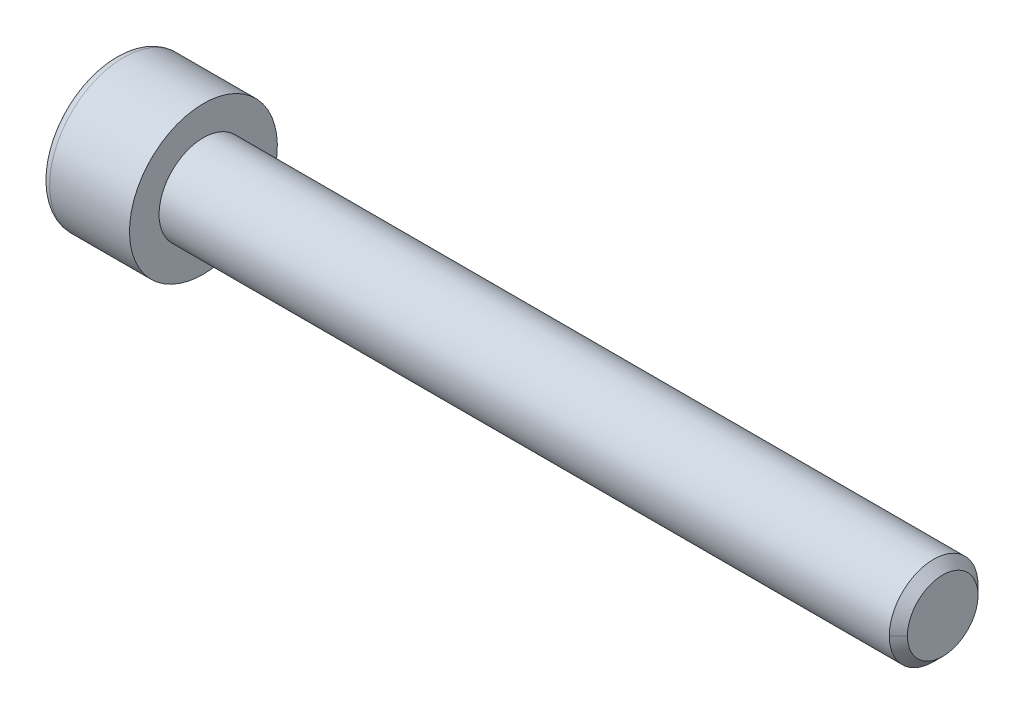
ISO-10303-21;
HEADER;
FILE_DESCRIPTION(('STEP AP214'),'2;1');
FILE_NAME('part.step','',(''),(''),'','','');
FILE_SCHEMA(('AUTOMOTIVE_DESIGN { 1 0 10303 214 1 1 1 1 }'));
ENDSEC;
DATA;
#1=APPLICATION_CONTEXT('core data for automotive mechanical design processes');
#2=APPLICATION_PROTOCOL_DEFINITION('international standard','automotive_design',2000,#1);
#3=PRODUCT_CONTEXT('',#1,'mechanical');
#4=PRODUCT('Part','Part','',(#3));
#5=PRODUCT_RELATED_PRODUCT_CATEGORY('part','',(#4));
#6=PRODUCT_DEFINITION_FORMATION('','',#4);
#7=PRODUCT_DEFINITION_CONTEXT('part definition',#1,'design');
#8=PRODUCT_DEFINITION('design','',#6,#7);
#9=PRODUCT_DEFINITION_SHAPE('','',#8);
#10=(LENGTH_UNIT() NAMED_UNIT(*) SI_UNIT(.MILLI.,.METRE.));
#11=(NAMED_UNIT(*) PLANE_ANGLE_UNIT() SI_UNIT($,.RADIAN.));
#12=(NAMED_UNIT(*) SI_UNIT($,.STERADIAN.) SOLID_ANGLE_UNIT());
#13=UNCERTAINTY_MEASURE_WITH_UNIT(LENGTH_MEASURE(1.E-05),#10,'distance_accuracy_value','');
#14=(GEOMETRIC_REPRESENTATION_CONTEXT(3) GLOBAL_UNCERTAINTY_ASSIGNED_CONTEXT((#13)) GLOBAL_UNIT_ASSIGNED_CONTEXT((#10,
#11,#12)) REPRESENTATION_CONTEXT('',''));
#15=CARTESIAN_POINT('',(0.,0.,0.));
#16=DIRECTION('',(0.,0.,1.));
#17=DIRECTION('',(1.,0.,0.));
#18=AXIS2_PLACEMENT_3D('',#15,#16,#17);
#19=CARTESIAN_POINT('',(50.,-2.4151886,-2.4151886));
#20=DIRECTION('',(1.,0.,0.));
#21=DIRECTION('',(0.,1.,0.));
#22=AXIS2_PLACEMENT_3D('',#19,#20,#21);
#23=PLANE('',#22);
#24=CARTESIAN_POINT('',(50.,0.,0.));
#25=DIRECTION('',(-1.,0.,0.));
#26=DIRECTION('',(0.,0.,1.));
#27=AXIS2_PLACEMENT_3D('',#24,#25,#26);
#28=CIRCLE('',#27,2.38655);
#29=CARTESIAN_POINT('',(50.,-8.1581597892579E-10,-2.38654999999998));
#30=VERTEX_POINT('',#29);
#31=CARTESIAN_POINT('',(50.,-2.85727898792572E-10,2.38654999999998));
#32=VERTEX_POINT('',#31);
#33=EDGE_CURVE('E88',#30,#32,#28,.F.);
#34=ORIENTED_EDGE('',*,*,#33,.T.);
#35=CARTESIAN_POINT('',(50.,0.,0.));
#36=DIRECTION('',(-1.,0.,0.));
#37=DIRECTION('',(0.,0.,1.));
#38=AXIS2_PLACEMENT_3D('',#35,#36,#37);
#39=CIRCLE('',#38,2.38655);
#40=EDGE_CURVE('E21',#32,#30,#39,.F.);
#41=ORIENTED_EDGE('',*,*,#40,.T.);
#42=EDGE_LOOP('',(#34,#41));
#43=FACE_BOUND('',#42,.T.);
#44=ADVANCED_FACE('F17',(#43),#23,.T.);
#45=CARTESIAN_POINT('',(50.,0.,2.38655));
#46=CARTESIAN_POINT('',(49.38655,0.,3.));
#47=(BOUNDED_CURVE() B_SPLINE_CURVE(1,(#45,#46),.UNSPECIFIED.,.F.,
.F.) B_SPLINE_CURVE_WITH_KNOTS((2,2),(0.,1.00000000000009),
.UNSPECIFIED.) CURVE() GEOMETRIC_REPRESENTATION_ITEM() RATIONAL_B_SPLINE_CURVE((1.,1.)) REPRESENTATION_ITEM(''));
#48=CARTESIAN_POINT('',(1049.38655,0.,0.));
#49=DIRECTION('',(-1.,0.,0.));
#50=AXIS1_PLACEMENT('',#48,#49);
#51=SURFACE_OF_REVOLUTION('',#47,#50);
#52=ORIENTED_EDGE('',*,*,#40,.F.);
#53=DIRECTION('',(-0.707106781186548,-1.26986739101621E-10,0.707106781186547));
#54=VECTOR('',#53,1.);
#55=CARTESIAN_POINT('',(49.693275,-4.83675477104059E-10,2.693275));
#56=LINE('',#55,#54);
#57=CARTESIAN_POINT('',(49.38655,-2.69379553018567E-10,2.99999999999999));
#58=VERTEX_POINT('',#57);
#59=EDGE_CURVE('E91',#32,#58,#56,.T.);
#60=ORIENTED_EDGE('',*,*,#59,.T.);
#61=CARTESIAN_POINT('',(49.38655,0.,0.));
#62=DIRECTION('',(-1.,0.,0.));
#63=DIRECTION('',(0.,0.,1.));
#64=AXIS2_PLACEMENT_3D('',#61,#62,#63);
#65=CIRCLE('',#64,3.);
#66=CARTESIAN_POINT('',(49.38655,-1.23062057109198E-09,-2.99999999999999));
#67=VERTEX_POINT('',#66);
#68=EDGE_CURVE('E95',#58,#67,#65,.F.);
#69=ORIENTED_EDGE('',*,*,#68,.T.);
#70=DIRECTION('',(0.707106781186548,2.90060050295602E-10,0.707106781186547));
#71=VECTOR('',#70,1.);
#72=CARTESIAN_POINT('',(49.693275,-1.10479987286926E-09,-2.693275));
#73=LINE('',#72,#71);
#74=EDGE_CURVE('E93',#67,#30,#73,.T.);
#75=ORIENTED_EDGE('',*,*,#74,.T.);
#76=EDGE_LOOP('',(#52,#60,#69,#75));
#77=FACE_BOUND('',#76,.T.);
#78=ADVANCED_FACE('F94',(#77),#51,.T.);
#79=CARTESIAN_POINT('',(50.0001414213562,0.,2.38640857864376));
#80=CARTESIAN_POINT('',(50.,0.,2.38655));
#81=CARTESIAN_POINT('',(49.38655,0.,3.));
#82=(BOUNDED_CURVE() B_SPLINE_CURVE(1,(#79,#80,#81),.UNSPECIFIED.,.F.,
.F.) B_SPLINE_CURVE_WITH_KNOTS((2,1,2),(-0.000230534427968627,1.85790651661862E-11,1.),
.UNSPECIFIED.) CURVE() GEOMETRIC_REPRESENTATION_ITEM() RATIONAL_B_SPLINE_CURVE((1.,1.,1.)) REPRESENTATION_ITEM(''));
#83=CARTESIAN_POINT('',(1049.38655,0.,0.));
#84=DIRECTION('',(-1.,0.,0.));
#85=AXIS1_PLACEMENT('',#83,#84);
#86=SURFACE_OF_REVOLUTION('',#82,#85);
#87=ORIENTED_EDGE('',*,*,#74,.F.);
#88=CARTESIAN_POINT('',(49.38655,0.,0.));
#89=DIRECTION('',(-1.,0.,0.));
#90=DIRECTION('',(0.,0.,1.));
#91=AXIS2_PLACEMENT_3D('',#88,#89,#90);
#92=CIRCLE('',#91,3.);
#93=EDGE_CURVE('E108',#67,#58,#92,.F.);
#94=ORIENTED_EDGE('',*,*,#93,.T.);
#95=ORIENTED_EDGE('',*,*,#59,.F.);
#96=ORIENTED_EDGE('',*,*,#33,.F.);
#97=EDGE_LOOP('',(#87,#94,#95,#96));
#98=FACE_BOUND('',#97,.T.);
#99=ADVANCED_FACE('F101',(#98),#86,.T.);
#100=CARTESIAN_POINT('',(-1.333333333,0.,0.));
#101=CARTESIAN_POINT('',(-3.01,0.,2.904071854));
#102=(BOUNDED_CURVE() B_SPLINE_CURVE(1,(#100,#101),.UNSPECIFIED.,.F.,
.F.) B_SPLINE_CURVE_WITH_KNOTS((2,2),(0.,1.),
.UNSPECIFIED.) CURVE() GEOMETRIC_REPRESENTATION_ITEM() RATIONAL_B_SPLINE_CURVE((1.,1.)) REPRESENTATION_ITEM(''));
#103=CARTESIAN_POINT('',(996.99,0.,0.));
#104=DIRECTION('',(-1.,0.,0.));
#105=AXIS1_PLACEMENT('',#103,#104);
#106=SURFACE_OF_REVOLUTION('',#102,#105);
#107=CARTESIAN_POINT('',(-1.333333333,0.,0.));
#108=VERTEX_POINT('',#107);
#109=VERTEX_LOOP('',#108);
#110=FACE_BOUND('',#109,.T.);
#111=CARTESIAN_POINT('',(-2.99999999990194,-2.5,-1.44337567259391));
#112=CARTESIAN_POINT('',(-2.98209574263693,-2.5,-1.38134905294953));
#113=CARTESIAN_POINT('',(-2.96498591501795,-2.5,-1.31908524854831));
#114=CARTESIAN_POINT('',(-2.9325586063815,-2.5,-1.19402341340579));
#115=CARTESIAN_POINT('',(-2.91724304001177,-2.5,-1.13122488732653));
#116=CARTESIAN_POINT('',(-2.88864230481174,-2.5,-1.00514627159482));
#117=CARTESIAN_POINT('',(-2.87535773971234,-2.5,-0.941866044598566));
#118=CARTESIAN_POINT('',(-2.84501155623976,-2.5,-0.783295355537952));
#119=CARTESIAN_POINT('',(-2.82935510407788,-2.5,-0.687729720023883));
#120=CARTESIAN_POINT('',(-2.8038363929103,-2.5,-0.49582792968208));
#121=CARTESIAN_POINT('',(-2.79397345365601,-2.5,-0.399491866661438));
#122=CARTESIAN_POINT('',(-2.78132126682311,-2.5,-0.217329774455165));
#123=CARTESIAN_POINT('',(-2.77785668029329,-2.5,-0.13155078285884));
#124=CARTESIAN_POINT('',(-2.77604418751081,-2.5,0.0400958904405022));
#125=CARTESIAN_POINT('',(-2.77769824160356,-2.5,0.125963593529663));
#126=CARTESIAN_POINT('',(-2.78605196619317,-2.5,0.297450074329791));
#127=CARTESIAN_POINT('',(-2.79275167480722,-2.5,0.383068850155342));
#128=CARTESIAN_POINT('',(-2.8108998117244,-2.5,0.553755303851712));
#129=CARTESIAN_POINT('',(-2.82234605098717,-2.5,0.638823217429646));
#130=CARTESIAN_POINT('',(-2.84954081955049,-2.5,0.808258474159647));
#131=CARTESIAN_POINT('',(-2.86528928104194,-2.5,0.892625828331925));
#132=CARTESIAN_POINT('',(-2.90056247218591,-2.5,1.06053688925276));
#133=CARTESIAN_POINT('',(-2.92008612509887,-2.5,1.14408082372909));
#134=CARTESIAN_POINT('',(-2.95044571186063,-2.5,1.26341360873709));
#135=CARTESIAN_POINT('',(-2.95996603514937,-2.5,1.29954359668296));
#136=CARTESIAN_POINT('',(-2.9795691964924,-2.5,1.37159959189587));
#137=CARTESIAN_POINT('',(-2.98965127625646,-2.5,1.40752580531338));
#138=CARTESIAN_POINT('',(-2.99999999995315,-2.5,1.44337567277131));
#139=B_SPLINE_CURVE_WITH_KNOTS('',3,(#111,#112,#113,#114,#115,#116,#117,#118,#119,#120,#121,
#122,#123,#124,#125,#126,#127,#128,#129,#130,#131,#132,#133,#134,#135,#136,#137,#138),
.UNSPECIFIED.,.F.,.F.,(4,2,2,2,2,2,2,2,2,2,2,2,2,4),(0.,0.193683427773067,0.38757168712609,
0.581517469676064,0.871873940003063,1.16219631114209,1.41959520256128,1.67709268522974,
1.93459211317248,2.1919729174537,2.44934966528471,2.70665311350898,2.81873929256059,
2.93067767377976),.UNSPECIFIED.);
#140=CARTESIAN_POINT('',(-2.99999999985056,-2.49999999997164,-1.44337567301637));
#141=VERTEX_POINT('',#140);
#142=CARTESIAN_POINT('',(-2.9999999999511,-2.49999999989483,1.44337567294638));
#143=VERTEX_POINT('',#142);
#144=EDGE_CURVE('E400',#141,#143,#139,.T.);
#145=ORIENTED_EDGE('',*,*,#144,.T.);
#146=CARTESIAN_POINT('',(-2.99999999994905,-2.49999999978965,1.44337567312145));
#147=CARTESIAN_POINT('',(-2.98209574268285,-2.44628337146572,1.47438898294478));
#148=CARTESIAN_POINT('',(-2.96498591506263,-2.39236133511698,1.50552088514654));
#149=CARTESIAN_POINT('',(-2.93255860642365,-2.2840546088376,1.56805180272011));
#150=CARTESIAN_POINT('',(-2.91724304005265,-2.22966948993171,1.5994510657609));
#151=CARTESIAN_POINT('',(-2.88864230485011,-2.12048220583196,1.66249037362911));
#152=CARTESIAN_POINT('',(-2.87535773974946,-2.06567992169489,1.69413048712842));
#153=CARTESIAN_POINT('',(-2.84501155627371,-1.92835367666992,1.77341583166181));
#154=CARTESIAN_POINT('',(-2.82935510410985,-1.84559140858412,1.82119864942075));
#155=CARTESIAN_POINT('',(-2.80383639293848,-1.67939958311269,1.91714954459552));
#156=CARTESIAN_POINT('',(-2.79397345368236,-1.59597010523433,1.96531757610781));
#157=CARTESIAN_POINT('',(-2.78132126684628,-1.43821310577522,2.05639862221371));
#158=CARTESIAN_POINT('',(-2.77785668031497,-1.36392631994176,2.09928811801266));
#159=CARTESIAN_POINT('',(-2.77604418752952,-1.2152759403893,2.18511145466395));
#160=CARTESIAN_POINT('',(-2.77769824162078,-1.14091232814936,2.22804530620937));
#161=CARTESIAN_POINT('',(-2.78605196620749,-0.992400679370574,2.31378854661114));
#162=CARTESIAN_POINT('',(-2.79275167482015,-0.918252644464542,2.35659793452478));
#163=CARTESIAN_POINT('',(-2.81089981173457,-0.770433839481277,2.44194116137469));
#164=CARTESIAN_POINT('',(-2.82234605099598,-0.696762865275693,2.48447511816451));
#165=CARTESIAN_POINT('',(-2.8495408195567,-0.550027628650418,2.56919274653124));
#166=CARTESIAN_POINT('',(-2.86528928104691,-0.476963356686943,2.61137642361826));
#167=CARTESIAN_POINT('',(-2.90056247218859,-0.331548112352686,2.69533195408042));
#168=CARTESIAN_POINT('',(-2.9200861251005,-0.259196942763867,2.73710392131946));
#169=CARTESIAN_POINT('',(-2.95044571185584,-0.155851719459382,2.79677031381484));
#170=CARTESIAN_POINT('',(-2.95996603513881,-0.124562232076772,2.81483530777832));
#171=CARTESIAN_POINT('',(-2.97956919646974,-0.0621599097610845,2.85086330536599));
#172=CARTESIAN_POINT('',(-2.98965127622746,-0.0310468962964689,2.86882641206541));
#173=CARTESIAN_POINT('',(-2.99999999991754,-3.72252951759761E-10,2.88675134578508));
#174=B_SPLINE_CURVE_WITH_KNOTS('',3,(#146,#147,#148,#149,#150,#151,#152,#153,#154,#155,#156,
#157,#158,#159,#160,#161,#162,#163,#164,#165,#166,#167,#168,#169,#170,#171,#172,#173),
.UNSPECIFIED.,.F.,.F.,(4,2,2,2,2,2,2,2,2,2,2,2,2,4),(0.,0.193683427778269,0.387571687136511,
0.581517469691713,0.871873940027135,1.16219631117457,1.41959520259521,1.67709268526511,
1.93459211320929,2.19197291749163,2.44934966532376,2.70665311354912,2.81873929254008,
2.93067767369877),.UNSPECIFIED.);
#175=CARTESIAN_POINT('',(-3.0000000000959,-1.62810287944994E-10,2.886751346094));
#176=VERTEX_POINT('',#175);
#177=EDGE_CURVE('E409',#143,#176,#174,.T.);
#178=ORIENTED_EDGE('',*,*,#177,.T.);
#179=CARTESIAN_POINT('',(-2.99999999997736,1.9280147525356E-10,2.88675134588869));
#180=CARTESIAN_POINT('',(-2.98209574271006,0.05371662851739,2.85573803606497));
#181=CARTESIAN_POINT('',(-2.96498591508868,0.107638664866787,2.82460613386283));
#182=CARTESIAN_POINT('',(-2.93255860644731,0.215945391147497,2.76207521628849));
#183=CARTESIAN_POINT('',(-2.91724304007509,0.27033051005406,2.73067595324732));
#184=CARTESIAN_POINT('',(-2.88864230487006,0.379517794155173,2.66763664537832));
#185=CARTESIAN_POINT('',(-2.87535773976816,0.434320078292939,2.63599653187861));
#186=CARTESIAN_POINT('',(-2.8450115562892,0.57164632331975,2.55671118734415));
#187=CARTESIAN_POINT('',(-2.82935510412338,0.65440859140672,2.50892836958454));
#188=CARTESIAN_POINT('',(-2.80383639294808,0.820600416880588,2.41297747440836));
#189=CARTESIAN_POINT('',(-2.79397345369,0.904029894760213,2.36480944289534));
#190=CARTESIAN_POINT('',(-2.78132126685048,1.06178689421983,2.27372839678915));
#191=CARTESIAN_POINT('',(-2.77785668031755,1.13607368005252,2.23083890099064));
#192=CARTESIAN_POINT('',(-2.77604418752874,1.28472405960351,2.1450155643402));
#193=CARTESIAN_POINT('',(-2.77769824161827,1.35908767184276,2.10208171279518));
#194=CARTESIAN_POINT('',(-2.78605196620148,1.50759932062025,2.01633847239416));
#195=CARTESIAN_POINT('',(-2.79275167481235,1.58174735552568,1.97352908448086));
#196=CARTESIAN_POINT('',(-2.81089981172326,1.7295661605078,1.88818585763161));
#197=CARTESIAN_POINT('',(-2.82234605098294,1.80323713471284,1.84565190084211));
#198=CARTESIAN_POINT('',(-2.8495408195403,1.94997237133708,1.76093427247597));
#199=CARTESIAN_POINT('',(-2.86528928102888,2.02303664330007,1.71875059538924));
#200=CARTESIAN_POINT('',(-2.90056247216742,2.1684518876334,1.63479506492761));
#201=CARTESIAN_POINT('',(-2.92008612507781,2.24080305722177,1.59302309768883));
#202=CARTESIAN_POINT('',(-2.95044571183394,2.34414828053542,1.53335670518816));
#203=CARTESIAN_POINT('',(-2.95996603511936,2.37543776792759,1.51529171121916));
#204=CARTESIAN_POINT('',(-2.97956919645556,2.4378400902623,1.47926371362051));
#205=CARTESIAN_POINT('',(-2.9896512762161,2.46895310373638,1.46130060691562));
#206=CARTESIAN_POINT('',(-2.99999999990917,2.49999999967002,1.44337567319052));
#207=B_SPLINE_CURVE_WITH_KNOTS('',3,(#179,#180,#181,#182,#183,#184,#185,#186,#187,#188,#189,
#190,#191,#192,#193,#194,#195,#196,#197,#198,#199,#200,#201,#202,#203,#204,#205,#206),
.UNSPECIFIED.,.F.,.F.,(4,2,2,2,2,2,2,2,2,2,2,2,2,4),(0.,0.193683427781386,0.387571687142756,
0.581517469701091,0.871873940041472,1.16219631119386,1.41959520261202,1.67709268527943,
1.93459211322111,2.19197291750089,2.44934966533046,2.70665311355327,2.81873929257813,
2.93067767377066),.UNSPECIFIED.);
#208=CARTESIAN_POINT('',(-2.9999999999511,2.49999999983501,1.44337567304999));
#209=VERTEX_POINT('',#208);
#210=EDGE_CURVE('E418',#176,#209,#207,.T.);
#211=ORIENTED_EDGE('',*,*,#210,.T.);
#212=CARTESIAN_POINT('',(-2.99999999999303,2.5,1.44337567290945));
#213=CARTESIAN_POINT('',(-2.98209574272447,2.5,1.38134905326268));
#214=CARTESIAN_POINT('',(-2.96498591510176,2.5,1.31908524885907));
#215=CARTESIAN_POINT('',(-2.93255860645764,2.5,1.19402341371172));
#216=CARTESIAN_POINT('',(-2.91724304008399,2.5,1.13122488763002));
#217=CARTESIAN_POINT('',(-2.88864230487602,2.5,1.00514627189332));
#218=CARTESIAN_POINT('',(-2.87535773977261,2.5,0.94186604489453));
#219=CARTESIAN_POINT('',(-2.84501155628974,2.5,0.783295355827017));
#220=CARTESIAN_POINT('',(-2.82935510412148,2.5,0.687729720308527));
#221=CARTESIAN_POINT('',(-2.80383639294123,2.5,0.495827929957529));
#222=CARTESIAN_POINT('',(-2.79397345368064,2.5,0.399491866932111));
#223=CARTESIAN_POINT('',(-2.78132126683661,2.5,0.217329774723812));
#224=CARTESIAN_POINT('',(-2.7778566803015,2.5,0.131550783130307));
#225=CARTESIAN_POINT('',(-2.77604418750818,2.5,-0.0400958901637057));
#226=CARTESIAN_POINT('',(-2.77769824159537,2.5,-0.125963593250358));
#227=CARTESIAN_POINT('',(-2.7860519661738,2.5,-0.29745007404579));
#228=CARTESIAN_POINT('',(-2.79275167478224,2.5,-0.383068849869153));
#229=CARTESIAN_POINT('',(-2.81089981168823,2.5,-0.553755303561258));
#230=CARTESIAN_POINT('',(-2.82234605094543,2.5,-0.638823217137117));
#231=CARTESIAN_POINT('',(-2.84954081949781,2.5,-0.808258473863209));
#232=CARTESIAN_POINT('',(-2.8652892809839,2.5,-0.892625828033653));
#233=CARTESIAN_POINT('',(-2.90056247211773,2.5,-1.06053688895091));
#234=CARTESIAN_POINT('',(-2.9200861250259,2.5,-1.14408082342549));
#235=CARTESIAN_POINT('',(-2.95044571178066,2.5,-1.26341360843007));
#236=CARTESIAN_POINT('',(-2.95996603506711,2.5,-1.29954359637421));
#237=CARTESIAN_POINT('',(-2.97956919640564,2.5,-1.37159959158371));
#238=CARTESIAN_POINT('',(-2.9896512761675,2.5,-1.40752580499953));
#239=CARTESIAN_POINT('',(-2.99999999986206,2.5,-1.44337567245577));
#240=B_SPLINE_CURVE_WITH_KNOTS('',3,(#212,#213,#214,#215,#216,#217,#218,#219,#220,#221,#222,
#223,#224,#225,#226,#227,#228,#229,#230,#231,#232,#233,#234,#235,#236,#237,#238,#239),
.UNSPECIFIED.,.F.,.F.,(4,2,2,2,2,2,2,2,2,2,2,2,2,4),(0.,0.193683427782941,0.387571687145881,
0.581517469705791,0.871873940048986,1.16219631120418,1.41959520261558,1.6770926852762,
1.93459211321108,2.19197291748389,2.44934966530652,2.70665311352239,2.81873929256726,
2.93067767377976),.UNSPECIFIED.);
#241=CARTESIAN_POINT('',(-2.9999999999511,2.50000000003146,-1.44337567270972));
#242=VERTEX_POINT('',#241);
#243=EDGE_CURVE('E427',#209,#242,#240,.T.);
#244=ORIENTED_EDGE('',*,*,#243,.T.);
#245=CARTESIAN_POINT('',(-3.00000000004014,2.50000000006292,-1.44337567296367));
#246=CARTESIAN_POINT('',(-2.98209574277019,2.44628337173678,-1.47438898278829));
#247=CARTESIAN_POINT('',(-2.96498591514619,2.39236133538579,-1.50552088499134));
#248=CARTESIAN_POINT('',(-2.93255860649956,2.28405460910186,-1.56805180256754));
#249=CARTESIAN_POINT('',(-2.91724304012469,2.22966949019366,-1.59945106560966));
#250=CARTESIAN_POINT('',(-2.88864230491419,2.12048220608924,-1.66249037348057));
#251=CARTESIAN_POINT('',(-2.87535773980948,2.0656799219498,-1.69413048698125));
#252=CARTESIAN_POINT('',(-2.8450115563234,1.92835367691897,-1.77341583151802));
#253=CARTESIAN_POINT('',(-2.82935510415318,1.84559140882962,-1.82119864927901));
#254=CARTESIAN_POINT('',(-2.80383639296923,1.67939958335076,-1.91714954445807));
#255=CARTESIAN_POINT('',(-2.7939734537069,1.59597010546853,-1.96531757597259));
#256=CARTESIAN_POINT('',(-2.78132126685985,1.43821310600813,-2.05639862207924));
#257=CARTESIAN_POINT('',(-2.77785668032333,1.36392632017731,-2.09928811787666));
#258=CARTESIAN_POINT('',(-2.77604418752705,1.21527594062986,-2.18511145452507));
#259=CARTESIAN_POINT('',(-2.7776982416127,1.14091232839229,-2.22804530606911));
#260=CARTESIAN_POINT('',(-2.78605196618806,0.992400679617963,-2.31378854646831));
#261=CARTESIAN_POINT('',(-2.79275167479497,0.918252644714026,-2.35659793438075));
#262=CARTESIAN_POINT('',(-2.81089981169805,0.77043383973447,-2.44194116122851));
#263=CARTESIAN_POINT('',(-2.82234605095387,0.696762865530502,-2.4844751180174));
#264=CARTESIAN_POINT('',(-2.84954081950371,0.55002762890825,-2.56919274638238));
#265=CARTESIAN_POINT('',(-2.86528928098864,0.476963356946185,-2.61137642346858));
#266=CARTESIAN_POINT('',(-2.90056247212028,0.331548112614633,-2.69533195392919));
#267=CARTESIAN_POINT('',(-2.92008612502744,0.259196943027112,-2.73710392116748));
#268=CARTESIAN_POINT('',(-2.95044571181407,0.155851719595239,-2.79677031373641));
#269=CARTESIAN_POINT('',(-2.95996603513553,0.124562232084562,-2.81483530777383));
#270=CARTESIAN_POINT('',(-2.97956919654802,0.0621599095141735,-2.85086330550854));
#271=CARTESIAN_POINT('',(-2.98965127634881,0.0310468959229215,-2.86882641228108));
#272=CARTESIAN_POINT('',(-3.00000000008409,-1.27376694826501E-10,-2.88675134607354));
#273=B_SPLINE_CURVE_WITH_KNOTS('',3,(#245,#246,#247,#248,#249,#250,#251,#252,#253,#254,#255,
#256,#257,#258,#259,#260,#261,#262,#263,#264,#265,#266,#267,#268,#269,#270,#271,#272),
.UNSPECIFIED.,.F.,.F.,(4,2,2,2,2,2,2,2,2,2,2,2,2,4),(0.,0.193683427788764,0.387571687157534,
0.581517469723277,0.87187394007394,1.16219631123659,1.41959520264876,1.67709268531015,
1.93459211324574,2.19197291752029,2.44934966534468,2.70665311356242,2.81873929301174,
2.93067767462766),.UNSPECIFIED.);
#274=CARTESIAN_POINT('',(-3.00000000004163,-1.18416519667169E-09,-2.886751346));
#275=VERTEX_POINT('',#274);
#276=EDGE_CURVE('E436',#242,#275,#273,.T.);
#277=ORIENTED_EDGE('',*,*,#276,.T.);
#278=CARTESIAN_POINT('',(-2.99999999981082,-6.92430306305458E-10,-2.88675134560023));
#279=CARTESIAN_POINT('',(-2.98209574255005,-0.0537166290131819,-2.85573803577872));
#280=CARTESIAN_POINT('',(-2.96498591493549,-0.107638665358749,-2.8246061335788));
#281=CARTESIAN_POINT('',(-2.93255860630814,-0.215945391631711,-2.76207521600893));
#282=CARTESIAN_POINT('',(-2.9172430399431,-0.270330510534358,-2.73067595297002));
#283=CARTESIAN_POINT('',(-2.88864230475259,-0.379517794627478,-2.66763664510564));
#284=CARTESIAN_POINT('',(-2.87535773965803,-0.43432007876117,-2.63599653160827));
#285=CARTESIAN_POINT('',(-2.84501155619788,-0.571646323777089,-2.55671118708011));
#286=CARTESIAN_POINT('',(-2.82935510404371,-0.654408591857143,-2.50892836932449));
#287=CARTESIAN_POINT('',(-2.8038363928916,-0.820600417316618,-2.41297747415662));
#288=CARTESIAN_POINT('',(-2.79397345364506,-0.904029895188767,-2.36480944264792));
#289=CARTESIAN_POINT('',(-2.78132126682574,-1.06178689464532,-2.27372839654349));
#290=CARTESIAN_POINT('',(-2.77785668030231,-1.13607368048253,-2.23083890074238));
#291=CARTESIAN_POINT('',(-2.7760441875333,-1.28472406004208,-2.14501556408699));
#292=CARTESIAN_POINT('',(-2.77769824163313,-1.35908767228535,-2.10208171253965));
#293=CARTESIAN_POINT('',(-2.78605196623694,-1.5075993210704,-2.01633847213427));
#294=CARTESIAN_POINT('',(-2.79275167485812,-1.58174735597935,-1.97352908421893));
#295=CARTESIAN_POINT('',(-2.81089981178956,-1.72956616096821,-1.88818585736579));
#296=CARTESIAN_POINT('',(-2.82234605105948,-1.80323713517648,-1.84565190057442));
#297=CARTESIAN_POINT('',(-2.84954081963674,-1.94997237180682,-1.76093427220477));
#298=CARTESIAN_POINT('',(-2.86528928113499,-2.02303664377268,-1.71875059511638));
#299=CARTESIAN_POINT('',(-2.90056247229208,-2.16845188811155,-1.63479506465155));
#300=CARTESIAN_POINT('',(-2.92008612521135,-2.2408030577026,-1.59302309741122));
#301=CARTESIAN_POINT('',(-2.95044571196894,-2.34414828098353,-1.53335670492944));
#302=CARTESIAN_POINT('',(-2.95996603524654,-2.37543776834049,-1.51529171098077));
#303=CARTESIAN_POINT('',(-2.9795691965657,-2.43784009060514,-1.47926371342257));
#304=CARTESIAN_POINT('',(-2.98965127631702,-2.46895310404436,-1.46130060673781));
#305=CARTESIAN_POINT('',(-3.00000000000026,-2.49999999994328,-1.44337567303274));
#306=B_SPLINE_CURVE_WITH_KNOTS('',3,(#278,#279,#280,#281,#282,#283,#284,#285,#286,#287,#288,
#289,#290,#291,#292,#293,#294,#295,#296,#297,#298,#299,#300,#301,#302,#303,#304,#305),
.UNSPECIFIED.,.F.,.F.,(4,2,2,2,2,2,2,2,2,2,2,2,2,4),(0.,0.193683427763163,0.387571687106229,
0.581517469646224,0.871873939957275,1.16219631108039,1.41959520251302,1.67709268519497,
1.93459211315123,2.19197291744619,2.44934966529089,2.70665311352883,2.8187392924298,
2.93067767349862),.UNSPECIFIED.);
#307=EDGE_CURVE('E439',#275,#141,#306,.T.);
#308=ORIENTED_EDGE('',*,*,#307,.T.);
#309=EDGE_LOOP('',(#145,#178,#211,#244,#277,#308));
#310=FACE_BOUND('',#309,.T.);
#311=ADVANCED_FACE('F180',(#110,#310),#106,.F.);
#312=CARTESIAN_POINT('',(0.,3.,0.));
#313=CARTESIAN_POINT('',(49.38655,3.,0.));
#314=(BOUNDED_CURVE() B_SPLINE_CURVE(1,(#312,#313),.UNSPECIFIED.,.F.,
.F.) B_SPLINE_CURVE_WITH_KNOTS((2,2),(0.,1.),
.UNSPECIFIED.) CURVE() GEOMETRIC_REPRESENTATION_ITEM() RATIONAL_B_SPLINE_CURVE((1.,1.)) REPRESENTATION_ITEM(''));
#315=CARTESIAN_POINT('',(38.,0.,0.));
#316=DIRECTION('',(1.,0.,0.));
#317=AXIS1_PLACEMENT('',#315,#316);
#318=SURFACE_OF_REVOLUTION('',#314,#317);
#319=CARTESIAN_POINT('',(0.,3.,-1.79585082180927E-10));
#320=CARTESIAN_POINT('',(0.,2.99999949522854,-0.0842305921750378));
#321=CARTESIAN_POINT('',(0.,2.99644943210249,-0.168476663816767));
#322=CARTESIAN_POINT('',(0.,2.98227226002267,-0.336386615205739));
#323=CARTESIAN_POINT('',(0.,2.97164306170328,-0.420050315701042));
#324=CARTESIAN_POINT('',(0.,2.9433554403765,-0.586325719994559));
#325=CARTESIAN_POINT('',(0.,2.92568585927662,-0.668935538006743));
#326=CARTESIAN_POINT('',(0.,2.88343927181851,-0.832418927670488));
#327=CARTESIAN_POINT('',(0.,2.85885666003996,-0.913291032780675));
#328=CARTESIAN_POINT('',(0.,2.77507914668652,-1.15208821042353));
#329=CARTESIAN_POINT('',(0.,2.70578575357263,-1.30659602074704));
#330=CARTESIAN_POINT('',(0.,2.54220609659893,-1.60176804528835));
#331=CARTESIAN_POINT('',(0.,2.44791888265401,-1.7424317329735));
#332=CARTESIAN_POINT('',(0.,2.2898892514552,-1.9399880430317));
#333=CARTESIAN_POINT('',(0.,2.23440451662689,-2.00363749105151));
#334=CARTESIAN_POINT('',(0.,2.11831409184965,-2.12599212156537));
#335=CARTESIAN_POINT('',(0.,2.05771339085062,-2.18470201190841));
#336=CARTESIAN_POINT('',(0.,1.93175254690532,-2.29683361022014));
#337=CARTESIAN_POINT('',(0.,1.86639026040711,-2.35025291063919));
#338=CARTESIAN_POINT('',(0.,1.7314038327038,-2.45140072832907));
#339=CARTESIAN_POINT('',(0.,1.6617787079112,-2.49912792468452));
#340=CARTESIAN_POINT('',(0.,1.44726826368351,-2.63320682475734));
#341=CARTESIAN_POINT('',(0.,1.29661475805599,-2.71057412209261));
#342=CARTESIAN_POINT('',(0.,0.984538397769613,-2.83887092032264));
#343=CARTESIAN_POINT('',(0.,0.823115658151992,-2.88980070358241));
#344=CARTESIAN_POINT('',(0.,0.493990143211312,-2.96385049100085));
#345=CARTESIAN_POINT('',(0.,0.326287334354949,-2.98697034664271));
#346=CARTESIAN_POINT('',(0.,-0.0106192603936318,-3.00472003813866));
#347=CARTESIAN_POINT('',(0.,-0.17982304628585,-2.99934987399276));
#348=CARTESIAN_POINT('',(0.,-0.514907479752218,-2.96029352943515));
#349=CARTESIAN_POINT('',(0.,-0.680788145068337,-2.92660750024165));
#350=CARTESIAN_POINT('',(0.,-1.00461791765848,-2.83181297787941));
#351=CARTESIAN_POINT('',(0.,-1.16256694019818,-2.77070419182062));
#352=CARTESIAN_POINT('',(0.,-1.38997847831572,-2.65990764648401));
#353=CARTESIAN_POINT('',(0.,-1.4642331937897,-2.61976066024325));
#354=CARTESIAN_POINT('',(0.,-1.60910065479403,-2.533356751595));
#355=CARTESIAN_POINT('',(0.,-1.67971423966904,-2.48710124614281));
#356=CARTESIAN_POINT('',(0.,-1.81676022403913,-2.38882598111958));
#357=CARTESIAN_POINT('',(0.,-1.88319450224164,-2.33680884100812));
#358=CARTESIAN_POINT('',(0.,-2.01149891436324,-2.22732998385631));
#359=CARTESIAN_POINT('',(0.,-2.07336458163727,-2.16986306080548));
#360=CARTESIAN_POINT('',(0.,-2.25127799284035,-1.99000567815265));
#361=CARTESIAN_POINT('',(0.,-2.35982375483851,-1.86002810586064));
#362=CARTESIAN_POINT('',(0.,-2.55351363036695,-1.58367858014144));
#363=CARTESIAN_POINT('',(0.,-2.63865863339631,-1.43730725016412));
#364=CARTESIAN_POINT('',(0.,-2.74706444478656,-1.20863511838851));
#365=CARTESIAN_POINT('',(0.,-2.78000876483221,-1.13079377999063));
#366=CARTESIAN_POINT('',(0.,-2.83919981745005,-0.972654562407022));
#367=CARTESIAN_POINT('',(0.,-2.86545197031175,-0.892358730644588));
#368=CARTESIAN_POINT('',(0.,-2.91105470876429,-0.729976188975372));
#369=CARTESIAN_POINT('',(0.,-2.93041619252482,-0.647892526873583));
#370=CARTESIAN_POINT('',(0.,-2.96215834911786,-0.482401803634151));
#371=CARTESIAN_POINT('',(0.,-2.97454108091422,-0.398995140300326));
#372=CARTESIAN_POINT('',(0.,-2.98892380783833,-0.262882669770961));
#373=CARTESIAN_POINT('',(0.,-2.99307606546448,-0.210394788269591));
#374=CARTESIAN_POINT('',(0.,-2.99861431926428,-0.105273286690342));
#375=CARTESIAN_POINT('',(0.,-3.00000031543792,-0.0526396666124634));
#376=CARTESIAN_POINT('',(0.,-2.99999949525662,0.08423059117464));
#377=CARTESIAN_POINT('',(0.,-2.99644943215868,0.168476662817318));
#378=CARTESIAN_POINT('',(0.,-2.98227226013492,0.336386614210605));
#379=CARTESIAN_POINT('',(0.,-2.97164306184346,0.420050314709274));
#380=CARTESIAN_POINT('',(0.,-2.94335544057218,0.586325719012307));
#381=CARTESIAN_POINT('',(0.,-2.92568585949981,0.668935537030642));
#382=CARTESIAN_POINT('',(0.,-2.88343927209611,0.832418926708934));
#383=CARTESIAN_POINT('',(0.,-2.85885666034446,0.913291031827523));
#384=CARTESIAN_POINT('',(0.,-2.77507914707055,1.15208820949849));
#385=CARTESIAN_POINT('',(0.,-2.70578575400817,1.30659601984509));
#386=CARTESIAN_POINT('',(0.,-2.54220609713286,1.60176804444093));
#387=CARTESIAN_POINT('',(0.,-2.44791888323482,1.74243173215752));
#388=CARTESIAN_POINT('',(0.,-2.28988925210187,1.93998804226839));
#389=CARTESIAN_POINT('',(0.,-2.23440451729478,2.00363749030669));
#390=CARTESIAN_POINT('',(0.,-2.11831409255835,2.12599212085923));
#391=CARTESIAN_POINT('',(0.,-2.0577133915789,2.18470201122247));
#392=CARTESIAN_POINT('',(0.,-1.93175254767098,2.29683360957618));
#393=CARTESIAN_POINT('',(0.,-1.86639026119057,2.35025291001703));
#394=CARTESIAN_POINT('',(0.,-1.73140383352095,2.45140072775192));
#395=CARTESIAN_POINT('',(0.,-1.66177870874426,2.49912792413059));
#396=CARTESIAN_POINT('',(0.,-1.44726826456124,2.63320682427492));
#397=CARTESIAN_POINT('',(0.,-1.2966147589595,2.71057412166041));
#398=CARTESIAN_POINT('',(0.,-0.984538398715892,2.83887091999447));
#399=CARTESIAN_POINT('',(0.,-0.823115659115253,2.88980070330804));
#400=CARTESIAN_POINT('',(0.,-0.493990144199262,2.96385049083619));
#401=CARTESIAN_POINT('',(0.,-0.326287335350607,2.98697034653395));
#402=CARTESIAN_POINT('',(0.,0.0106192593920578,3.0047200381422));
#403=CARTESIAN_POINT('',(0.,0.179823045286068,2.99934987405271));
#404=CARTESIAN_POINT('',(0.,0.514907478765461,2.96029352960678));
#405=CARTESIAN_POINT('',(0.,0.680788144092814,2.92660750046858));
#406=CARTESIAN_POINT('',(0.,1.00461791671455,2.83181297821428));
#407=CARTESIAN_POINT('',(0.,1.16256693927462,2.77070419220814));
#408=CARTESIAN_POINT('',(0.,1.38997847742907,2.65990764694734));
#409=CARTESIAN_POINT('',(0.,1.46423319291643,2.61976066073134));
#410=CARTESIAN_POINT('',(0.,1.60910065394954,2.53335675213139));
#411=CARTESIAN_POINT('',(0.,1.67971423883995,2.48710124670275));
#412=CARTESIAN_POINT('',(0.,1.8167602232428,2.3888259817252));
#413=CARTESIAN_POINT('',(0.,1.88319450146267,2.33680884163588));
#414=CARTESIAN_POINT('',(0.,2.01149891362077,2.22732998452683));
#415=CARTESIAN_POINT('',(0.,2.07336458091398,2.16986306149661));
#416=CARTESIAN_POINT('',(0.,2.25127799217701,1.99000567890308));
#417=CARTESIAN_POINT('',(0.,2.35982375421849,1.86002810664726));
#418=CARTESIAN_POINT('',(0.,2.55351362983904,1.58367858099263));
#419=CARTESIAN_POINT('',(0.,2.63865863291721,1.43730725104369));
#420=CARTESIAN_POINT('',(0.,2.74706444438359,1.20863511930439));
#421=CARTESIAN_POINT('',(0.,2.78000876445511,1.13079378091769));
#422=CARTESIAN_POINT('',(0.,2.83919981712553,0.972654563354268));
#423=CARTESIAN_POINT('',(0.,2.86545197001395,0.89235873160084));
#424=CARTESIAN_POINT('',(0.,2.91105470852067,0.729976189946919));
#425=CARTESIAN_POINT('',(0.,2.93041619230863,0.647892527851413));
#426=CARTESIAN_POINT('',(0.,2.96215834895697,0.482401804622162));
#427=CARTESIAN_POINT('',(0.,2.97454108078118,0.398995141292235));
#428=CARTESIAN_POINT('',(0.,2.98892380778573,0.262882670435772));
#429=CARTESIAN_POINT('',(0.,2.99307606544695,0.210394788602458));
#430=CARTESIAN_POINT('',(0.,2.99861431928181,0.105273286357474));
#431=CARTESIAN_POINT('',(0.,3.00000031545547,0.052639665945805));
#432=CARTESIAN_POINT('',(0.,3.,-1.79585082180927E-10));
#433=B_SPLINE_CURVE_WITH_KNOTS('',3,(#319,#320,#321,#322,#323,#324,#325,#326,#327,#328,#329,
#330,#331,#332,#333,#334,#335,#336,#337,#338,#339,#340,#341,#342,#343,#344,#345,#346,#347,#348,
#349,#350,#351,#352,#353,#354,#355,#356,#357,#358,#359,#360,#361,#362,#363,#364,#365,#366,#367,
#368,#369,#370,#371,#372,#373,#374,#375,#376,#377,#378,#379,#380,#381,#382,#383,#384,#385,#386,
#387,#388,#389,#390,#391,#392,#393,#394,#395,#396,#397,#398,#399,#400,#401,#402,#403,#404,#405,
#406,#407,#408,#409,#410,#411,#412,#413,#414,#415,#416,#417,#418,#419,#420,#421,#422,#423,#424,
#425,#426,#427,#428,#429,#430,#431,#432),.UNSPECIFIED.,.T.,.F.,(4,2,2,2,2,2,2,2,2,2,2,2,2,2,2,2,
2,2,2,2,2,2,2,2,2,2,2,2,2,2,2,2,2,2,2,2,2,2,2,2,2,2,2,2,2,2,2,2,2,2,2,2,2,2,2,2,4),(0.,
0.252643316184543,0.505361231639865,0.758481275542631,1.01180715618274,1.51725134291917,
2.02271474576027,2.27577762012549,2.52859650376464,2.78152991223796,3.03452190295018,
3.53997839705089,4.04542949252892,4.55088328731834,5.05633708210776,5.56178817758577,
6.0672446716865,6.32023666239877,6.57317007087212,6.82598895451123,7.07905182887641,
7.58451523171754,8.08995941845395,8.34328529909469,8.59640534299822,8.84912325845305,
9.10176657463668,9.25965528719948,9.41754399976228,9.67018731594591,9.92290523140074,
10.1760252753043,10.429351155945,10.9347953426814,11.4402587455226,11.6933216198877,
11.9461405035268,12.1990739120002,12.4520659027125,12.9575223968132,13.4629734922912,
13.9684272870806,14.47388108187,14.9793321773481,15.4847886714488,15.737780662161,
15.9907140706343,16.2435329542735,16.4965958286387,17.0020592314798,17.5075034182162,
17.7608292988563,18.0139493427591,18.2666672582144,18.519310574399,18.6771992879614,
18.8350880015239),.UNSPECIFIED.);
#434=CARTESIAN_POINT('',(0.,3.,-1.79585082180927E-10));
#435=VERTEX_POINT('',#434);
#436=EDGE_CURVE('E384',#435,#435,#433,.T.);
#437=ORIENTED_EDGE('',*,*,#436,.F.);
#438=EDGE_LOOP('',(#437));
#439=FACE_BOUND('',#438,.T.);
#440=ORIENTED_EDGE('',*,*,#68,.F.);
#441=ORIENTED_EDGE('',*,*,#93,.F.);
#442=EDGE_LOOP('',(#440,#441));
#443=FACE_BOUND('',#442,.T.);
#444=ADVANCED_FACE('F173',(#439,#443),#318,.T.);
#445=CARTESIAN_POINT('',(-6.,-2.5,-1.443375673));
#446=DIRECTION('',(0.,-0.500000000006738,-0.866025403780548));
#447=DIRECTION('',(0.,0.866025403780548,-0.500000000006738));
#448=AXIS2_PLACEMENT_3D('',#445,#446,#447);
#449=PLANE('',#448);
#450=DIRECTION('',(0.,0.866025403780548,-0.500000000006738));
#451=VECTOR('',#450,1.);
#452=CARTESIAN_POINT('',(-6.,-2.50000000332919,-1.44337567107789));
#453=LINE('',#452,#451);
#454=CARTESIAN_POINT('',(-6.,-2.5,-1.443375673));
#455=VERTEX_POINT('',#454);
#456=CARTESIAN_POINT('',(-6.,0.,-2.886751346));
#457=VERTEX_POINT('',#456);
#458=EDGE_CURVE('E380',#455,#457,#453,.T.);
#459=ORIENTED_EDGE('',*,*,#458,.F.);
#460=DIRECTION('',(1.,0.,0.));
#461=VECTOR('',#460,1.);
#462=CARTESIAN_POINT('',(-6.,-2.5,-1.443375673));
#463=LINE('',#462,#461);
#464=EDGE_CURVE('E390',#455,#141,#463,.T.);
#465=ORIENTED_EDGE('',*,*,#464,.T.);
#466=ORIENTED_EDGE('',*,*,#307,.F.);
#467=DIRECTION('',(1.,0.,0.));
#468=VECTOR('',#467,1.);
#469=CARTESIAN_POINT('',(-6.,0.,-2.886751346));
#470=LINE('',#469,#468);
#471=EDGE_CURVE('E430',#275,#457,#470,.F.);
#472=ORIENTED_EDGE('',*,*,#471,.T.);
#473=EDGE_LOOP('',(#459,#465,#466,#472));
#474=FACE_BOUND('',#473,.T.);
#475=ADVANCED_FACE('F179',(#474),#449,.F.);
#476=CARTESIAN_POINT('',(-6.,0.,-2.886751346));
#477=DIRECTION('',(0.,0.500000000006738,-0.866025403780548));
#478=DIRECTION('',(0.,0.866025403780548,0.500000000006738));
#479=AXIS2_PLACEMENT_3D('',#476,#477,#478);
#480=PLANE('',#479);
#481=DIRECTION('',(0.,0.866025403780548,0.500000000006738));
#482=VECTOR('',#481,1.);
#483=CARTESIAN_POINT('',(-6.,3.35008062957165E-10,-2.88675134580658));
#484=LINE('',#483,#482);
#485=CARTESIAN_POINT('',(-6.,2.5,-1.443375673));
#486=VERTEX_POINT('',#485);
#487=EDGE_CURVE('E375',#457,#486,#484,.T.);
#488=ORIENTED_EDGE('',*,*,#487,.F.);
#489=ORIENTED_EDGE('',*,*,#471,.F.);
#490=ORIENTED_EDGE('',*,*,#276,.F.);
#491=DIRECTION('',(1.,0.,0.));
#492=VECTOR('',#491,1.);
#493=CARTESIAN_POINT('',(-6.,2.5,-1.443375673));
#494=LINE('',#493,#492);
#495=EDGE_CURVE('E421',#242,#486,#494,.F.);
#496=ORIENTED_EDGE('',*,*,#495,.T.);
#497=EDGE_LOOP('',(#488,#489,#490,#496));
#498=FACE_BOUND('',#497,.T.);
#499=ADVANCED_FACE('F237',(#498),#480,.F.);
#500=CARTESIAN_POINT('',(-6.,2.5,-1.443375673));
#501=DIRECTION('',(0.,1.,0.));
#502=DIRECTION('',(0.,0.,1.));
#503=AXIS2_PLACEMENT_3D('',#500,#501,#502);
#504=PLANE('',#503);
#505=DIRECTION('',(0.,0.,1.));
#506=VECTOR('',#505,1.);
#507=CARTESIAN_POINT('',(-6.,2.5,-4.452851156));
#508=LINE('',#507,#506);
#509=CARTESIAN_POINT('',(-6.,2.5,1.443375673));
#510=VERTEX_POINT('',#509);
#511=EDGE_CURVE('E370',#486,#510,#508,.T.);
#512=ORIENTED_EDGE('',*,*,#511,.F.);
#513=ORIENTED_EDGE('',*,*,#495,.F.);
#514=ORIENTED_EDGE('',*,*,#243,.F.);
#515=DIRECTION('',(1.,0.,0.));
#516=VECTOR('',#515,1.);
#517=CARTESIAN_POINT('',(-6.,2.5,1.443375673));
#518=LINE('',#517,#516);
#519=EDGE_CURVE('E412',#209,#510,#518,.F.);
#520=ORIENTED_EDGE('',*,*,#519,.T.);
#521=EDGE_LOOP('',(#512,#513,#514,#520));
#522=FACE_BOUND('',#521,.T.);
#523=ADVANCED_FACE('F248',(#522),#504,.F.);
#524=CARTESIAN_POINT('',(-6.,2.5,1.443375673));
#525=DIRECTION('',(0.,0.500000000006738,0.866025403780548));
#526=DIRECTION('',(0.,-0.866025403780548,0.500000000006738));
#527=AXIS2_PLACEMENT_3D('',#524,#525,#526);
#528=PLANE('',#527);
#529=DIRECTION('',(0.,-0.866025403780548,0.500000000006738));
#530=VECTOR('',#529,1.);
#531=CARTESIAN_POINT('',(-6.,2.50000000218616,1.44337567173782));
#532=LINE('',#531,#530);
#533=CARTESIAN_POINT('',(-6.,0.,2.886751346));
#534=VERTEX_POINT('',#533);
#535=EDGE_CURVE('E365',#510,#534,#532,.T.);
#536=ORIENTED_EDGE('',*,*,#535,.F.);
#537=ORIENTED_EDGE('',*,*,#519,.F.);
#538=ORIENTED_EDGE('',*,*,#210,.F.);
#539=DIRECTION('',(1.,0.,0.));
#540=VECTOR('',#539,1.);
#541=CARTESIAN_POINT('',(-6.,0.,2.886751346));
#542=LINE('',#541,#540);
#543=EDGE_CURVE('E403',#176,#534,#542,.F.);
#544=ORIENTED_EDGE('',*,*,#543,.T.);
#545=EDGE_LOOP('',(#536,#537,#538,#544));
#546=FACE_BOUND('',#545,.T.);
#547=ADVANCED_FACE('F260',(#546),#528,.F.);
#548=CARTESIAN_POINT('',(-6.,0.,2.886751346));
#549=DIRECTION('',(0.,-0.500000000006738,0.866025403780548));
#550=DIRECTION('',(0.,-0.866025403780548,-0.500000000006738));
#551=AXIS2_PLACEMENT_3D('',#548,#549,#550);
#552=PLANE('',#551);
#553=DIRECTION('',(0.,-0.866025403780548,-0.500000000006738));
#554=VECTOR('',#553,1.);
#555=CARTESIAN_POINT('',(-6.,-1.47803644323652E-09,2.88675134514666));
#556=LINE('',#555,#554);
#557=CARTESIAN_POINT('',(-6.,-2.5,1.443375673));
#558=VERTEX_POINT('',#557);
#559=EDGE_CURVE('E360',#534,#558,#556,.T.);
#560=ORIENTED_EDGE('',*,*,#559,.F.);
#561=ORIENTED_EDGE('',*,*,#543,.F.);
#562=ORIENTED_EDGE('',*,*,#177,.F.);
#563=DIRECTION('',(1.,0.,0.));
#564=VECTOR('',#563,1.);
#565=CARTESIAN_POINT('',(-6.,-2.5,1.443375673));
#566=LINE('',#565,#564);
#567=EDGE_CURVE('E37',#143,#558,#566,.F.);
#568=ORIENTED_EDGE('',*,*,#567,.T.);
#569=EDGE_LOOP('',(#560,#561,#562,#568));
#570=FACE_BOUND('',#569,.T.);
#571=ADVANCED_FACE('F272',(#570),#552,.F.);
#572=CARTESIAN_POINT('',(-6.,-2.5,1.443375673));
#573=DIRECTION('',(0.,-1.,0.));
#574=DIRECTION('',(0.,0.,-1.));
#575=AXIS2_PLACEMENT_3D('',#572,#573,#574);
#576=PLANE('',#575);
#577=DIRECTION('',(0.,0.,1.));
#578=VECTOR('',#577,1.);
#579=CARTESIAN_POINT('',(-6.,-2.5,-4.452851156));
#580=LINE('',#579,#578);
#581=EDGE_CURVE('E353',#558,#455,#580,.F.);
#582=ORIENTED_EDGE('',*,*,#581,.F.);
#583=ORIENTED_EDGE('',*,*,#567,.F.);
#584=ORIENTED_EDGE('',*,*,#144,.F.);
#585=ORIENTED_EDGE('',*,*,#464,.F.);
#586=EDGE_LOOP('',(#582,#583,#584,#585));
#587=FACE_BOUND('',#586,.T.);
#588=ADVANCED_FACE('F284',(#587),#576,.F.);
#589=CARTESIAN_POINT('',(0.,-5.06,-5.06));
#590=DIRECTION('',(1.,0.,0.));
#591=DIRECTION('',(0.,1.,0.));
#592=AXIS2_PLACEMENT_3D('',#589,#590,#591);
#593=PLANE('',#592);
#594=ORIENTED_EDGE('',*,*,#436,.T.);
#595=EDGE_LOOP('',(#594));
#596=FACE_BOUND('',#595,.T.);
#597=CARTESIAN_POINT('',(0.,-5.,-1.36735672614309E-09));
#598=CARTESIAN_POINT('',(0.,-4.99999915873093,-0.1403843213387));
#599=CARTESIAN_POINT('',(0.,-4.99408238702102,-0.280794440666639));
#600=CARTESIAN_POINT('',(0.,-4.9704537663411,-0.560644359832753));
#601=CARTESIAN_POINT('',(0.,-4.95273843509479,-0.700083860917793));
#602=CARTESIAN_POINT('',(0.,-4.90559240134803,-0.977209534013473));
#603=CARTESIAN_POINT('',(0.,-4.8761431020319,-1.11489256304542));
#604=CARTESIAN_POINT('',(0.,-4.80573211592266,-1.3873648818192));
#605=CARTESIAN_POINT('',(0.,-4.76476108675255,-1.5221517273292));
#606=CARTESIAN_POINT('',(0.,-4.62513193664993,-1.92014700836385));
#607=CARTESIAN_POINT('',(0.,-4.50964306355637,-2.17765998099878));
#608=CARTESIAN_POINT('',(0.,-4.2370100190221,-2.66961346426397));
#609=CARTESIAN_POINT('',(0.,-4.07986426408667,-2.90405309734733));
#610=CARTESIAN_POINT('',(0.,-3.81648235527979,-3.23331330163833));
#611=CARTESIAN_POINT('',(0.,-3.72400830254342,-3.33939552006088));
#612=CARTESIAN_POINT('',(0.,-3.53052271086168,-3.54332050222846));
#613=CARTESIAN_POINT('',(0.,-3.42951948930152,-3.64117111143619));
#614=CARTESIAN_POINT('',(0.,-3.21959040664394,-3.82805492637088));
#615=CARTESIAN_POINT('',(0.,-3.11066097738325,-3.91708411780892));
#616=CARTESIAN_POINT('',(0.,-2.88566250698332,-4.08567194936108));
#617=CARTESIAN_POINT('',(0.,-2.76959181807259,-4.16522839121251));
#618=CARTESIAN_POINT('',(0.,-2.5312001007099,-4.3142530219406));
#619=CARTESIAN_POINT('',(0.,-2.40888119646335,-4.38372460891051));
#620=CARTESIAN_POINT('',(0.,-2.15878295258326,-4.51214208445818));
#621=CARTESIAN_POINT('',(0.,-2.03100161745775,-4.57108408501734));
#622=CARTESIAN_POINT('',(0.,-1.77096719306665,-4.67797171401264));
#623=CARTESIAN_POINT('',(0.,-1.63871583022658,-4.72592153342911));
#624=CARTESIAN_POINT('',(0.,-1.37062989563233,-4.81052635476596));
#625=CARTESIAN_POINT('',(0.,-1.23479400153465,-4.8471771233692));
#626=CARTESIAN_POINT('',(0.,-0.823472476061552,-4.93970715756802));
#627=CARTESIAN_POINT('',(0.,-0.543890940375886,-4.97827976400943));
#628=CARTESIAN_POINT('',(0.,0.0177774859068243,-5.00787087740524));
#629=CARTESIAN_POINT('',(0.,0.29986437650387,-4.99888938435966));
#630=CARTESIAN_POINT('',(0.,0.718631639217638,-4.95009200506971));
#631=CARTESIAN_POINT('',(0.,0.85756670989322,-4.92791735510874));
#632=CARTESIAN_POINT('',(0.,1.13305856337866,-4.87195055437947));
#633=CARTESIAN_POINT('',(0.,1.26961621638751,-4.8381627524409));
#634=CARTESIAN_POINT('',(0.,1.53944254186719,-4.75919047136215));
#635=CARTESIAN_POINT('',(0.,1.67270993784532,-4.71400164303495));
#636=CARTESIAN_POINT('',(0.,1.93491737950438,-4.61257463895536));
#637=CARTESIAN_POINT('',(0.,2.06385900108922,-4.55634053937811));
#638=CARTESIAN_POINT('',(0.,2.31659005978445,-4.43319037315174));
#639=CARTESIAN_POINT('',(0.,2.44037774151014,-4.36627070401586));
#640=CARTESIAN_POINT('',(0.,2.68184533876972,-4.22225831530058));
#641=CARTESIAN_POINT('',(0.,2.79952666196642,-4.14516795495734));
#642=CARTESIAN_POINT('',(0.,3.027930780609,-3.98137742221169));
#643=CARTESIAN_POINT('',(0.,3.13865670265584,-3.89468161680724));
#644=CARTESIAN_POINT('',(0.,3.35249899408445,-3.71221642303864));
#645=CARTESIAN_POINT('',(0.,3.45560791650269,-3.61643835867795));
#646=CARTESIAN_POINT('',(0.,3.75212943017158,-3.31667627977534));
#647=CARTESIAN_POINT('',(0.,3.93303944570524,-3.10004688164547));
#648=CARTESIAN_POINT('',(0.,4.2558561975243,-2.6394642599436));
#649=CARTESIAN_POINT('',(0.,4.3977644163284,-2.3955120754493));
#650=CARTESIAN_POINT('',(0.,4.57844072829775,-2.01439186662056));
#651=CARTESIAN_POINT('',(0.,4.63334793818934,-1.88465629996355));
#652=CARTESIAN_POINT('',(0.,4.73199969969368,-1.62109093536613));
#653=CARTESIAN_POINT('',(0.,4.77575328513243,-1.48726454979513));
#654=CARTESIAN_POINT('',(0.,4.85175784724008,-1.21662698084787));
#655=CARTESIAN_POINT('',(0.,4.88402698751983,-1.07982087714803));
#656=CARTESIAN_POINT('',(0.,4.93693058228697,-0.804003004933699));
#657=CARTESIAN_POINT('',(0.,4.95756846838104,-0.664991899425502));
#658=CARTESIAN_POINT('',(0.,4.98153967979375,-0.438137781897532));
#659=CARTESIAN_POINT('',(0.,4.98846010918207,-0.350657979389537));
#660=CARTESIAN_POINT('',(0.,4.99769053214492,-0.17545547674388));
#661=CARTESIAN_POINT('',(0.,5.00000052571944,-0.0877327766062179));
#662=CARTESIAN_POINT('',(0.,4.99999915877772,0.14038431967137));
#663=CARTESIAN_POINT('',(0.,4.99408238711467,0.280794439000891));
#664=CARTESIAN_POINT('',(0.,4.97045376652818,0.560644358174197));
#665=CARTESIAN_POINT('',(0.,4.95273843532843,0.700083859264846));
#666=CARTESIAN_POINT('',(0.,4.90559240167415,0.977209532376388));
#667=CARTESIAN_POINT('',(0.,4.87614310240387,1.11489256141858));
#668=CARTESIAN_POINT('',(0.,4.80573211638532,1.38736488021661));
#669=CARTESIAN_POINT('',(0.,4.76476108726005,1.52215172574061));
#670=CARTESIAN_POINT('',(0.,4.62513193728998,1.92014700682212));
#671=CARTESIAN_POINT('',(0.,4.50964306428227,2.17765997949554));
#672=CARTESIAN_POINT('',(0.,4.23701001991199,2.66961346285161));
#673=CARTESIAN_POINT('',(0.,4.07986426505469,2.90405309598737));
#674=CARTESIAN_POINT('',(0.,3.81648235635757,3.23331330036616));
#675=CARTESIAN_POINT('',(0.,3.72400830365657,3.33939551881952));
#676=CARTESIAN_POINT('',(0.,3.53052271204285,3.54332050105156));
#677=CARTESIAN_POINT('',(0.,3.42951949051532,3.64117111029295));
#678=CARTESIAN_POINT('',(0.,3.21959040792004,3.82805492529762));
#679=CARTESIAN_POINT('',(0.,3.11066097868901,3.91708411677198));
#680=CARTESIAN_POINT('',(0.,2.88566250834525,4.08567194839917));
#681=CARTESIAN_POINT('',(0.,2.76959181946102,4.16522839028931));
#682=CARTESIAN_POINT('',(0.,2.53120010214797,4.31425302109687));
#683=CARTESIAN_POINT('',(0.,2.40888119792458,4.38372460810755));
#684=CARTESIAN_POINT('',(0.,2.15878295408729,4.51214208373859));
#685=CARTESIAN_POINT('',(0.,2.03100161898142,4.57108408434035));
#686=CARTESIAN_POINT('',(0.,1.77096719462594,4.67797171342233));
#687=CARTESIAN_POINT('',(0.,1.63871583180186,4.72592153288288));
#688=CARTESIAN_POINT('',(0.,1.37062989723582,4.81052635430909));
#689=CARTESIAN_POINT('',(0.,1.23479400315037,4.84717712295761));
#690=CARTESIAN_POINT('',(0.,0.823472477708116,4.93970715729353));
#691=CARTESIAN_POINT('',(0.,0.54389094203531,4.97827976382813));
#692=CARTESIAN_POINT('',(0.,-0.0177774842375377,5.00787087741117));
#693=CARTESIAN_POINT('',(0.,-0.299864374837579,4.99888938445961));
#694=CARTESIAN_POINT('',(0.,-0.71863163756762,4.95009200530926));
#695=CARTESIAN_POINT('',(0.,-0.857566708250598,4.92791735539459));
#696=CARTESIAN_POINT('',(0.,-1.1330585617547,4.87195055475715));
#697=CARTESIAN_POINT('',(0.,-1.26961621477482,4.8381627528641));
#698=CARTESIAN_POINT('',(0.,-1.53944254028083,4.75919047187529));
#699=CARTESIAN_POINT('',(0.,-1.67270993627401,4.71400164359251));
#700=CARTESIAN_POINT('',(0.,-1.93491737796687,4.61257463960033));
#701=CARTESIAN_POINT('',(0.,-2.06385899957045,4.55634054006606));
#702=CARTESIAN_POINT('',(0.,-2.31659005830671,4.43319037392395));
#703=CARTESIAN_POINT('',(0.,-2.44037774005468,4.36627070482933));
#704=CARTESIAN_POINT('',(0.,-2.68184533736223,4.22225831619458));
#705=CARTESIAN_POINT('',(0.,-2.79952666058461,4.14516795589058));
#706=CARTESIAN_POINT('',(0.,-3.02793077928179,3.98137742322107));
#707=CARTESIAN_POINT('',(0.,-3.13865670135755,3.89468161785351));
#708=CARTESIAN_POINT('',(0.,-3.35249899284701,3.71221642415616));
#709=CARTESIAN_POINT('',(0.,-3.4556079152972,3.61643835982983));
#710=CARTESIAN_POINT('',(0.,-3.75212942906602,3.31667628102606));
#711=CARTESIAN_POINT('',(0.,-3.93303944467187,3.1000468829565));
#712=CARTESIAN_POINT('',(0.,-4.25585619664447,2.63946426136225));
#713=CARTESIAN_POINT('',(0.,-4.39776441552989,2.39551207691524));
#714=CARTESIAN_POINT('',(0.,-4.57844072762614,2.01439186814702));
#715=CARTESIAN_POINT('',(0.,-4.63334793756085,1.88465630150865));
#716=CARTESIAN_POINT('',(0.,-4.73199969915283,1.62109093694487));
#717=CARTESIAN_POINT('',(0.,-4.77575328463609,1.48726455138887));
#718=CARTESIAN_POINT('',(0.,-4.85175784683404,1.21662698246711));
#719=CARTESIAN_POINT('',(0.,-4.88402698715951,1.07982087877774));
#720=CARTESIAN_POINT('',(0.,-4.93693058201881,0.80400300658038));
#721=CARTESIAN_POINT('',(0.,-4.95756846815931,0.664991901078679));
#722=CARTESIAN_POINT('',(0.,-4.98153967970608,0.438137783005546));
#723=CARTESIAN_POINT('',(0.,-4.98846010915284,0.350657979944312));
#724=CARTESIAN_POINT('',(0.,-4.99769053217414,0.175455476189099));
#725=CARTESIAN_POINT('',(0.,-5.00000052574869,0.08773277549512));
#726=CARTESIAN_POINT('',(0.,-5.,-1.36735672614309E-09));
#727=B_SPLINE_CURVE_WITH_KNOTS('',3,(#597,#598,#599,#600,#601,#602,#603,#604,#605,#606,#607,
#608,#609,#610,#611,#612,#613,#614,#615,#616,#617,#618,#619,#620,#621,#622,#623,#624,#625,#626,
#627,#628,#629,#630,#631,#632,#633,#634,#635,#636,#637,#638,#639,#640,#641,#642,#643,#644,#645,
#646,#647,#648,#649,#650,#651,#652,#653,#654,#655,#656,#657,#658,#659,#660,#661,#662,#663,#664,
#665,#666,#667,#668,#669,#670,#671,#672,#673,#674,#675,#676,#677,#678,#679,#680,#681,#682,#683,
#684,#685,#686,#687,#688,#689,#690,#691,#692,#693,#694,#695,#696,#697,#698,#699,#700,#701,#702,
#703,#704,#705,#706,#707,#708,#709,#710,#711,#712,#713,#714,#715,#716,#717,#718,#719,#720,#721,
#722,#723,#724,#725,#726),.UNSPECIFIED.,.T.,.F.,(4,2,2,2,2,2,2,2,2,2,2,2,2,2,2,2,2,2,2,2,2,2,2,
2,2,2,2,2,2,2,2,2,2,2,2,2,2,2,2,2,2,2,2,2,2,2,2,2,2,2,2,2,2,2,2,2,2,2,2,2,2,2,2,2,4),(0.,
0.421072193640904,0.842268719399774,1.26413545923772,1.68634526030456,2.52875223819862,
3.37119124293379,3.79296270020915,4.2143275062744,4.63588318706326,5.05753650491696,
5.47904741519443,5.90071364686408,6.32221884179846,6.74388176703581,7.58630475835151,
8.42872774966721,8.85039067490455,9.27189586983891,9.69356210150857,10.1150730117861,
10.5367263296398,10.9582820104288,11.3796468164939,11.8014182737692,12.6438572785045,
13.4862642563985,13.9084740574664,14.3303407973056,14.7515373230636,15.172609516703,
15.4357573709744,15.6989052252457,16.1199774188851,16.5411739446431,16.9630406844823,
17.3852504855502,18.2276574634442,19.0700964681795,19.4918679254548,19.9132327315199,
20.3347884123089,20.7564417301626,21.1779526404401,21.5996188721098,22.0211240670442,
22.4427869922815,23.2852099835972,24.1276329749129,24.5492959001502,24.9708010950846,
25.3924673267543,25.8139782370317,26.2356315548854,26.6571872356743,27.0785520417395,
27.5003234990149,28.3427625037501,29.1851694816441,29.607379282711,30.0292460225489,
30.4504425483078,30.8715147419487,31.1346625978861,31.3978104538235),.UNSPECIFIED.);
#728=CARTESIAN_POINT('',(0.,-5.,-1.36735672614309E-09));
#729=VERTEX_POINT('',#728);
#730=EDGE_CURVE('E347',#729,#729,#727,.T.);
#731=ORIENTED_EDGE('',*,*,#730,.T.);
#732=EDGE_LOOP('',(#731));
#733=FACE_BOUND('',#732,.T.);
#734=ADVANCED_FACE('F295',(#596,#733),#593,.T.);
#735=CARTESIAN_POINT('',(-6.,4.452800303,-4.452851156));
#736=DIRECTION('',(-1.,0.,0.));
#737=DIRECTION('',(0.,-1.,0.));
#738=AXIS2_PLACEMENT_3D('',#735,#736,#737);
#739=PLANE('',#738);
#740=ORIENTED_EDGE('',*,*,#559,.T.);
#741=ORIENTED_EDGE('',*,*,#581,.T.);
#742=ORIENTED_EDGE('',*,*,#458,.T.);
#743=ORIENTED_EDGE('',*,*,#487,.T.);
#744=ORIENTED_EDGE('',*,*,#511,.T.);
#745=ORIENTED_EDGE('',*,*,#535,.T.);
#746=EDGE_LOOP('',(#740,#741,#742,#743,#744,#745));
#747=FACE_BOUND('',#746,.T.);
#748=CARTESIAN_POINT('',(-6.,0.,0.));
#749=DIRECTION('',(1.,0.,0.));
#750=DIRECTION('',(0.,1.,0.));
#751=AXIS2_PLACEMENT_3D('',#748,#749,#750);
#752=CIRCLE('',#751,4.4);
#753=CARTESIAN_POINT('',(-6.,4.4,0.));
#754=VERTEX_POINT('',#753);
#755=EDGE_CURVE('E11',#754,#754,#752,.T.);
#756=ORIENTED_EDGE('',*,*,#755,.F.);
#757=EDGE_LOOP('',(#756));
#758=FACE_BOUND('',#757,.T.);
#759=ADVANCED_FACE('F152',(#747,#758),#739,.T.);
#760=CARTESIAN_POINT('',(-5.4,5.,0.));
#761=CARTESIAN_POINT('',(0.,5.,0.));
#762=(BOUNDED_CURVE() B_SPLINE_CURVE(1,(#760,#761),.UNSPECIFIED.,.F.,
.F.) B_SPLINE_CURVE_WITH_KNOTS((2,2),(0.,1.),
.UNSPECIFIED.) CURVE() GEOMETRIC_REPRESENTATION_ITEM() RATIONAL_B_SPLINE_CURVE((1.,1.)) REPRESENTATION_ITEM(''));
#763=CARTESIAN_POINT('',(-3.,0.,0.));
#764=DIRECTION('',(1.,0.,0.));
#765=AXIS1_PLACEMENT('',#763,#764);
#766=SURFACE_OF_REVOLUTION('',#762,#765);
#767=CARTESIAN_POINT('',(-5.4,0.,0.));
#768=DIRECTION('',(1.,0.,0.));
#769=DIRECTION('',(0.,1.,0.));
#770=AXIS2_PLACEMENT_3D('',#767,#768,#769);
#771=CIRCLE('',#770,5.);
#772=CARTESIAN_POINT('',(-5.4,5.,0.));
#773=VERTEX_POINT('',#772);
#774=EDGE_CURVE('E28',#773,#773,#771,.F.);
#775=ORIENTED_EDGE('',*,*,#774,.F.);
#776=EDGE_LOOP('',(#775));
#777=FACE_BOUND('',#776,.T.);
#778=ORIENTED_EDGE('',*,*,#730,.F.);
#779=EDGE_LOOP('',(#778));
#780=FACE_BOUND('',#779,.T.);
#781=ADVANCED_FACE('F146',(#777,#780),#766,.T.);
#782=CARTESIAN_POINT('',(-5.4,0.,0.));
#783=DIRECTION('',(1.,0.,0.));
#784=DIRECTION('',(0.,1.,0.));
#785=AXIS2_PLACEMENT_3D('',#782,#783,#784);
#786=TOROIDAL_SURFACE('',#785,4.4,0.599999999999999);
#787=ORIENTED_EDGE('',*,*,#774,.T.);
#788=EDGE_LOOP('',(#787));
#789=FACE_BOUND('',#788,.T.);
#790=ORIENTED_EDGE('',*,*,#755,.T.);
#791=EDGE_LOOP('',(#790));
#792=FACE_BOUND('',#791,.T.);
#793=ADVANCED_FACE('F19',(#789,#792),#786,.T.);
#794=CLOSED_SHELL('',(#44,#78,#99,#311,#444,#475,#499,#523,#547,#571,#588,#734,#759,#781,#793));
#795=MANIFOLD_SOLID_BREP('B1',#794);
#796=ADVANCED_BREP_SHAPE_REPRESENTATION('',(#18,#795),#14);
#797=SHAPE_DEFINITION_REPRESENTATION(#9,#796);
ENDSEC;
END-ISO-10303-21;
